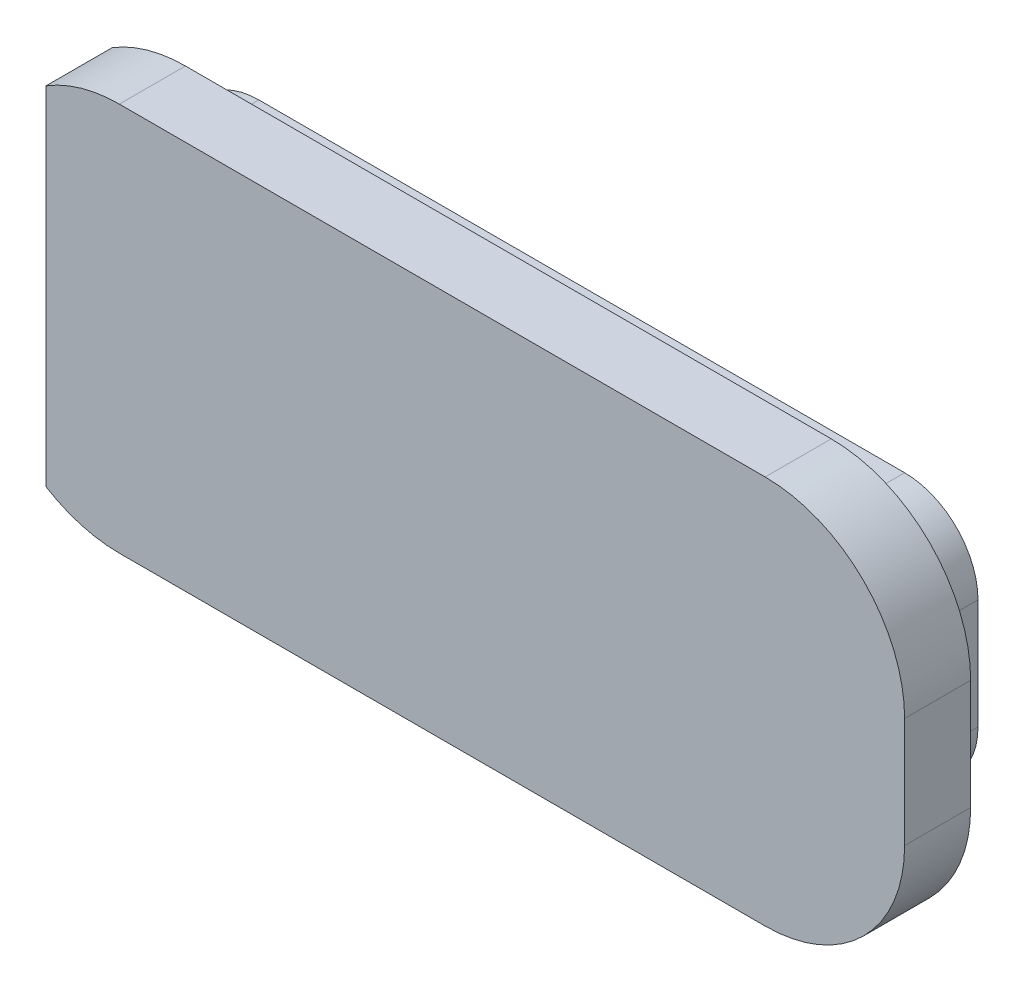
ISO-10303-21;
HEADER;
FILE_DESCRIPTION(('STEP AP214'),'2;1');
FILE_NAME('part.step','',(''),(''),'','','');
FILE_SCHEMA(('AUTOMOTIVE_DESIGN { 1 0 10303 214 1 1 1 1 }'));
ENDSEC;
DATA;
#1=APPLICATION_CONTEXT('core data for automotive mechanical design processes');
#2=APPLICATION_PROTOCOL_DEFINITION('international standard','automotive_design',2000,#1);
#3=PRODUCT_CONTEXT('',#1,'mechanical');
#4=PRODUCT('Part','Part','',(#3));
#5=PRODUCT_RELATED_PRODUCT_CATEGORY('part','',(#4));
#6=PRODUCT_DEFINITION_FORMATION('','',#4);
#7=PRODUCT_DEFINITION_CONTEXT('part definition',#1,'design');
#8=PRODUCT_DEFINITION('design','',#6,#7);
#9=PRODUCT_DEFINITION_SHAPE('','',#8);
#10=(LENGTH_UNIT() NAMED_UNIT(*) SI_UNIT(.MILLI.,.METRE.));
#11=(NAMED_UNIT(*) PLANE_ANGLE_UNIT() SI_UNIT($,.RADIAN.));
#12=(NAMED_UNIT(*) SI_UNIT($,.STERADIAN.) SOLID_ANGLE_UNIT());
#13=UNCERTAINTY_MEASURE_WITH_UNIT(LENGTH_MEASURE(1.E-05),#10,'distance_accuracy_value','');
#14=(GEOMETRIC_REPRESENTATION_CONTEXT(3) GLOBAL_UNCERTAINTY_ASSIGNED_CONTEXT((#13)) GLOBAL_UNIT_ASSIGNED_CONTEXT((#10,
#11,#12)) REPRESENTATION_CONTEXT('',''));
#15=CARTESIAN_POINT('',(0.,0.,0.));
#16=DIRECTION('',(0.,0.,1.));
#17=DIRECTION('',(1.,0.,0.));
#18=AXIS2_PLACEMENT_3D('',#15,#16,#17);
#19=CARTESIAN_POINT('',(1.,1.,-1.));
#20=DIRECTION('',(0.,0.,1.));
#21=DIRECTION('',(1.,0.,0.));
#22=AXIS2_PLACEMENT_3D('',#19,#20,#21);
#23=CYLINDRICAL_SURFACE('',#22,1.);
#24=CARTESIAN_POINT('',(1.,1.,0.));
#25=DIRECTION('',(0.,0.,1.));
#26=DIRECTION('',(1.,0.,0.));
#27=AXIS2_PLACEMENT_3D('',#24,#25,#26);
#28=CIRCLE('',#27,1.);
#29=CARTESIAN_POINT('',(0.,1.,0.));
#30=VERTEX_POINT('',#29);
#31=CARTESIAN_POINT('',(1.,0.,0.));
#32=VERTEX_POINT('',#31);
#33=EDGE_CURVE('E137',#30,#32,#28,.T.);
#34=ORIENTED_EDGE('',*,*,#33,.F.);
#35=DIRECTION('',(0.,0.,1.));
#36=VECTOR('',#35,1.);
#37=CARTESIAN_POINT('',(0.,1.,-1.));
#38=LINE('',#37,#36);
#39=CARTESIAN_POINT('',(0.,1.,-1.));
#40=VERTEX_POINT('',#39);
#41=EDGE_CURVE('E11',#40,#30,#38,.T.);
#42=ORIENTED_EDGE('',*,*,#41,.F.);
#43=CARTESIAN_POINT('',(1.,1.,-1.));
#44=DIRECTION('',(0.,0.,1.));
#45=DIRECTION('',(1.,0.,0.));
#46=AXIS2_PLACEMENT_3D('',#43,#44,#45);
#47=CIRCLE('',#46,1.);
#48=CARTESIAN_POINT('',(1.,0.,-1.));
#49=VERTEX_POINT('',#48);
#50=EDGE_CURVE('E155',#40,#49,#47,.T.);
#51=ORIENTED_EDGE('',*,*,#50,.T.);
#52=DIRECTION('',(0.,0.,1.));
#53=VECTOR('',#52,1.);
#54=CARTESIAN_POINT('',(1.,0.,-1.));
#55=LINE('',#54,#53);
#56=EDGE_CURVE('E42',#49,#32,#55,.T.);
#57=ORIENTED_EDGE('',*,*,#56,.T.);
#58=EDGE_LOOP('',(#34,#42,#51,#57));
#59=FACE_BOUND('',#58,.T.);
#60=ADVANCED_FACE('F39',(#59),#23,.T.);
#61=CARTESIAN_POINT('',(0.,2.5,-1.));
#62=DIRECTION('',(-1.,0.,0.));
#63=DIRECTION('',(0.,0.,1.));
#64=AXIS2_PLACEMENT_3D('',#61,#62,#63);
#65=PLANE('',#64);
#66=ORIENTED_EDGE('',*,*,#41,.T.);
#67=DIRECTION('',(0.,-1.,0.));
#68=VECTOR('',#67,1.);
#69=CARTESIAN_POINT('',(0.,-0.61554944214,0.));
#70=LINE('',#69,#68);
#71=CARTESIAN_POINT('',(0.,-0.61554944214,0.));
#72=VERTEX_POINT('',#71);
#73=EDGE_CURVE('E169',#30,#72,#70,.T.);
#74=ORIENTED_EDGE('',*,*,#73,.T.);
#75=DIRECTION('',(0.,0.,-1.));
#76=VECTOR('',#75,1.);
#77=CARTESIAN_POINT('',(0.,-0.61554944214,0.9));
#78=LINE('',#77,#76);
#79=CARTESIAN_POINT('',(0.,-0.61554944214,0.9));
#80=VERTEX_POINT('',#79);
#81=EDGE_CURVE('E186',#80,#72,#78,.T.);
#82=ORIENTED_EDGE('',*,*,#81,.F.);
#83=DIRECTION('',(0.,-1.,0.));
#84=VECTOR('',#83,1.);
#85=CARTESIAN_POINT('',(0.,-0.61554944214,0.9));
#86=LINE('',#85,#84);
#87=CARTESIAN_POINT('',(0.,4.11554944214,0.9));
#88=VERTEX_POINT('',#87);
#89=EDGE_CURVE('E189',#88,#80,#86,.T.);
#90=ORIENTED_EDGE('',*,*,#89,.F.);
#91=DIRECTION('',(0.,0.,-1.));
#92=VECTOR('',#91,1.);
#93=CARTESIAN_POINT('',(0.,4.11554944214,0.9));
#94=LINE('',#93,#92);
#95=CARTESIAN_POINT('',(0.,4.11554944214,0.));
#96=VERTEX_POINT('',#95);
#97=EDGE_CURVE('E188',#88,#96,#94,.T.);
#98=ORIENTED_EDGE('',*,*,#97,.T.);
#99=CARTESIAN_POINT('',(0.,2.5,0.));
#100=VERTEX_POINT('',#99);
#101=EDGE_CURVE('E176',#96,#100,#70,.T.);
#102=ORIENTED_EDGE('',*,*,#101,.T.);
#103=DIRECTION('',(0.,0.,1.));
#104=VECTOR('',#103,1.);
#105=CARTESIAN_POINT('',(0.,2.5,-1.));
#106=LINE('',#105,#104);
#107=CARTESIAN_POINT('',(0.,2.5,-1.));
#108=VERTEX_POINT('',#107);
#109=EDGE_CURVE('E48',#108,#100,#106,.T.);
#110=ORIENTED_EDGE('',*,*,#109,.F.);
#111=DIRECTION('',(0.,-1.,0.));
#112=VECTOR('',#111,1.);
#113=CARTESIAN_POINT('',(0.,2.5,-1.));
#114=LINE('',#113,#112);
#115=EDGE_CURVE('E127',#108,#40,#114,.T.);
#116=ORIENTED_EDGE('',*,*,#115,.T.);
#117=EDGE_LOOP('',(#66,#74,#82,#90,#98,#102,#110,#116));
#118=FACE_BOUND('',#117,.T.);
#119=ADVANCED_FACE('F234',(#118),#65,.T.);
#120=CARTESIAN_POINT('',(1.,2.5,-1.));
#121=DIRECTION('',(0.,0.,1.));
#122=DIRECTION('',(1.,0.,0.));
#123=AXIS2_PLACEMENT_3D('',#120,#121,#122);
#124=CYLINDRICAL_SURFACE('',#123,1.);
#125=CARTESIAN_POINT('',(1.,2.5,0.));
#126=DIRECTION('',(0.,0.,1.));
#127=DIRECTION('',(1.,0.,0.));
#128=AXIS2_PLACEMENT_3D('',#125,#126,#127);
#129=CIRCLE('',#128,1.);
#130=CARTESIAN_POINT('',(1.,3.5,0.));
#131=VERTEX_POINT('',#130);
#132=EDGE_CURVE('E117',#131,#100,#129,.T.);
#133=ORIENTED_EDGE('',*,*,#132,.F.);
#134=DIRECTION('',(0.,0.,1.));
#135=VECTOR('',#134,1.);
#136=CARTESIAN_POINT('',(1.,3.5,-1.));
#137=LINE('',#136,#135);
#138=CARTESIAN_POINT('',(1.,3.5,-1.));
#139=VERTEX_POINT('',#138);
#140=EDGE_CURVE('E83',#139,#131,#137,.T.);
#141=ORIENTED_EDGE('',*,*,#140,.F.);
#142=CARTESIAN_POINT('',(1.,2.5,-1.));
#143=DIRECTION('',(0.,0.,1.));
#144=DIRECTION('',(1.,0.,0.));
#145=AXIS2_PLACEMENT_3D('',#142,#143,#144);
#146=CIRCLE('',#145,1.);
#147=EDGE_CURVE('E114',#139,#108,#146,.T.);
#148=ORIENTED_EDGE('',*,*,#147,.T.);
#149=ORIENTED_EDGE('',*,*,#109,.T.);
#150=EDGE_LOOP('',(#133,#141,#148,#149));
#151=FACE_BOUND('',#150,.T.);
#152=ADVANCED_FACE('F112',(#151),#124,.T.);
#153=CARTESIAN_POINT('',(9.8,3.5,-1.));
#154=DIRECTION('',(0.,1.,0.));
#155=DIRECTION('',(0.,0.,1.));
#156=AXIS2_PLACEMENT_3D('',#153,#154,#155);
#157=PLANE('',#156);
#158=DIRECTION('',(-1.,0.,0.));
#159=VECTOR('',#158,1.);
#160=CARTESIAN_POINT('',(9.8,3.5,0.));
#161=LINE('',#160,#159);
#162=CARTESIAN_POINT('',(9.8,3.5,0.));
#163=VERTEX_POINT('',#162);
#164=EDGE_CURVE('E153',#163,#131,#161,.T.);
#165=ORIENTED_EDGE('',*,*,#164,.F.);
#166=DIRECTION('',(0.,0.,1.));
#167=VECTOR('',#166,1.);
#168=CARTESIAN_POINT('',(9.8,3.5,-1.));
#169=LINE('',#168,#167);
#170=CARTESIAN_POINT('',(9.8,3.5,-1.));
#171=VERTEX_POINT('',#170);
#172=EDGE_CURVE('E119',#171,#163,#169,.T.);
#173=ORIENTED_EDGE('',*,*,#172,.F.);
#174=DIRECTION('',(-1.,0.,0.));
#175=VECTOR('',#174,1.);
#176=CARTESIAN_POINT('',(9.8,3.5,-1.));
#177=LINE('',#176,#175);
#178=EDGE_CURVE('E125',#171,#139,#177,.T.);
#179=ORIENTED_EDGE('',*,*,#178,.T.);
#180=ORIENTED_EDGE('',*,*,#140,.T.);
#181=EDGE_LOOP('',(#165,#173,#179,#180));
#182=FACE_BOUND('',#181,.T.);
#183=ADVANCED_FACE('F129',(#182),#157,.T.);
#184=CARTESIAN_POINT('',(9.8,2.5,-1.));
#185=DIRECTION('',(0.,0.,1.));
#186=DIRECTION('',(1.,0.,0.));
#187=AXIS2_PLACEMENT_3D('',#184,#185,#186);
#188=CYLINDRICAL_SURFACE('',#187,1.);
#189=CARTESIAN_POINT('',(9.8,2.5,0.));
#190=DIRECTION('',(0.,0.,1.));
#191=DIRECTION('',(1.,0.,0.));
#192=AXIS2_PLACEMENT_3D('',#189,#190,#191);
#193=CIRCLE('',#192,1.);
#194=CARTESIAN_POINT('',(10.8,2.5,0.));
#195=VERTEX_POINT('',#194);
#196=EDGE_CURVE('E150',#195,#163,#193,.T.);
#197=ORIENTED_EDGE('',*,*,#196,.F.);
#198=DIRECTION('',(0.,0.,1.));
#199=VECTOR('',#198,1.);
#200=CARTESIAN_POINT('',(10.8,2.5,-1.));
#201=LINE('',#200,#199);
#202=CARTESIAN_POINT('',(10.8,2.5,-1.));
#203=VERTEX_POINT('',#202);
#204=EDGE_CURVE('E159',#203,#195,#201,.T.);
#205=ORIENTED_EDGE('',*,*,#204,.F.);
#206=CARTESIAN_POINT('',(9.8,2.5,-1.));
#207=DIRECTION('',(0.,0.,1.));
#208=DIRECTION('',(1.,0.,0.));
#209=AXIS2_PLACEMENT_3D('',#206,#207,#208);
#210=CIRCLE('',#209,1.);
#211=EDGE_CURVE('E130',#203,#171,#210,.T.);
#212=ORIENTED_EDGE('',*,*,#211,.T.);
#213=ORIENTED_EDGE('',*,*,#172,.T.);
#214=EDGE_LOOP('',(#197,#205,#212,#213));
#215=FACE_BOUND('',#214,.T.);
#216=ADVANCED_FACE('F224',(#215),#188,.T.);
#217=CARTESIAN_POINT('',(10.8,1.,-1.));
#218=DIRECTION('',(1.,0.,0.));
#219=DIRECTION('',(0.,0.,-1.));
#220=AXIS2_PLACEMENT_3D('',#217,#218,#219);
#221=PLANE('',#220);
#222=DIRECTION('',(0.,1.,0.));
#223=VECTOR('',#222,1.);
#224=CARTESIAN_POINT('',(10.8,1.,0.));
#225=LINE('',#224,#223);
#226=CARTESIAN_POINT('',(10.8,1.,0.));
#227=VERTEX_POINT('',#226);
#228=EDGE_CURVE('E147',#227,#195,#225,.T.);
#229=ORIENTED_EDGE('',*,*,#228,.F.);
#230=DIRECTION('',(0.,0.,1.));
#231=VECTOR('',#230,1.);
#232=CARTESIAN_POINT('',(10.8,1.,-1.));
#233=LINE('',#232,#231);
#234=CARTESIAN_POINT('',(10.8,1.,-1.));
#235=VERTEX_POINT('',#234);
#236=EDGE_CURVE('E161',#235,#227,#233,.T.);
#237=ORIENTED_EDGE('',*,*,#236,.F.);
#238=DIRECTION('',(0.,1.,0.));
#239=VECTOR('',#238,1.);
#240=CARTESIAN_POINT('',(10.8,1.,-1.));
#241=LINE('',#240,#239);
#242=EDGE_CURVE('E132',#235,#203,#241,.T.);
#243=ORIENTED_EDGE('',*,*,#242,.T.);
#244=ORIENTED_EDGE('',*,*,#204,.T.);
#245=EDGE_LOOP('',(#229,#237,#243,#244));
#246=FACE_BOUND('',#245,.T.);
#247=ADVANCED_FACE('F218',(#246),#221,.T.);
#248=CARTESIAN_POINT('',(9.8,1.,-1.));
#249=DIRECTION('',(0.,0.,1.));
#250=DIRECTION('',(1.,0.,0.));
#251=AXIS2_PLACEMENT_3D('',#248,#249,#250);
#252=CYLINDRICAL_SURFACE('',#251,1.);
#253=CARTESIAN_POINT('',(9.8,1.,0.));
#254=DIRECTION('',(0.,0.,1.));
#255=DIRECTION('',(1.,0.,0.));
#256=AXIS2_PLACEMENT_3D('',#253,#254,#255);
#257=CIRCLE('',#256,1.);
#258=CARTESIAN_POINT('',(9.8,0.,0.));
#259=VERTEX_POINT('',#258);
#260=EDGE_CURVE('E144',#259,#227,#257,.T.);
#261=ORIENTED_EDGE('',*,*,#260,.F.);
#262=DIRECTION('',(0.,0.,1.));
#263=VECTOR('',#262,1.);
#264=CARTESIAN_POINT('',(9.8,0.,-1.));
#265=LINE('',#264,#263);
#266=CARTESIAN_POINT('',(9.8,0.,-1.));
#267=VERTEX_POINT('',#266);
#268=EDGE_CURVE('E162',#267,#259,#265,.T.);
#269=ORIENTED_EDGE('',*,*,#268,.F.);
#270=CARTESIAN_POINT('',(9.8,1.,-1.));
#271=DIRECTION('',(0.,0.,1.));
#272=DIRECTION('',(1.,0.,0.));
#273=AXIS2_PLACEMENT_3D('',#270,#271,#272);
#274=CIRCLE('',#273,1.);
#275=EDGE_CURVE('E212',#267,#235,#274,.T.);
#276=ORIENTED_EDGE('',*,*,#275,.T.);
#277=ORIENTED_EDGE('',*,*,#236,.T.);
#278=EDGE_LOOP('',(#261,#269,#276,#277));
#279=FACE_BOUND('',#278,.T.);
#280=ADVANCED_FACE('F222',(#279),#252,.T.);
#281=CARTESIAN_POINT('',(1.,0.,-1.));
#282=DIRECTION('',(0.,-1.,0.));
#283=DIRECTION('',(0.,0.,-1.));
#284=AXIS2_PLACEMENT_3D('',#281,#282,#283);
#285=PLANE('',#284);
#286=DIRECTION('',(1.,0.,0.));
#287=VECTOR('',#286,1.);
#288=CARTESIAN_POINT('',(1.,0.,0.));
#289=LINE('',#288,#287);
#290=EDGE_CURVE('E140',#32,#259,#289,.T.);
#291=ORIENTED_EDGE('',*,*,#290,.F.);
#292=ORIENTED_EDGE('',*,*,#56,.F.);
#293=DIRECTION('',(1.,0.,0.));
#294=VECTOR('',#293,1.);
#295=CARTESIAN_POINT('',(1.,0.,-1.));
#296=LINE('',#295,#294);
#297=EDGE_CURVE('E210',#49,#267,#296,.T.);
#298=ORIENTED_EDGE('',*,*,#297,.T.);
#299=ORIENTED_EDGE('',*,*,#268,.T.);
#300=EDGE_LOOP('',(#291,#292,#298,#299));
#301=FACE_BOUND('',#300,.T.);
#302=ADVANCED_FACE('F165',(#301),#285,.T.);
#303=CARTESIAN_POINT('',(1.,1.,-1.));
#304=DIRECTION('',(0.,0.,1.));
#305=DIRECTION('',(1.,0.,0.));
#306=AXIS2_PLACEMENT_3D('',#303,#304,#305);
#307=PLANE('',#306);
#308=ORIENTED_EDGE('',*,*,#50,.F.);
#309=ORIENTED_EDGE('',*,*,#115,.F.);
#310=ORIENTED_EDGE('',*,*,#147,.F.);
#311=ORIENTED_EDGE('',*,*,#178,.F.);
#312=ORIENTED_EDGE('',*,*,#211,.F.);
#313=ORIENTED_EDGE('',*,*,#242,.F.);
#314=ORIENTED_EDGE('',*,*,#275,.F.);
#315=ORIENTED_EDGE('',*,*,#297,.F.);
#316=EDGE_LOOP('',(#308,#309,#310,#311,#312,#313,#314,#315));
#317=FACE_BOUND('',#316,.T.);
#318=ADVANCED_FACE('F123',(#317),#307,.F.);
#319=CARTESIAN_POINT('',(1.00000000000008,1.00000000000013,0.9));
#320=DIRECTION('',(0.,0.,-1.));
#321=DIRECTION('',(-1.,0.,0.));
#322=AXIS2_PLACEMENT_3D('',#319,#320,#321);
#323=CYLINDRICAL_SURFACE('',#322,1.89999999999985);
#324=CARTESIAN_POINT('',(1.00000000000008,1.00000000000013,0.));
#325=DIRECTION('',(0.,0.,1.));
#326=DIRECTION('',(1.,0.,0.));
#327=AXIS2_PLACEMENT_3D('',#324,#325,#326);
#328=CIRCLE('',#327,1.89999999999985);
#329=CARTESIAN_POINT('',(1.00000000000008,-0.899999999999723,0.));
#330=VERTEX_POINT('',#329);
#331=EDGE_CURVE('E173',#72,#330,#328,.T.);
#332=ORIENTED_EDGE('',*,*,#331,.T.);
#333=DIRECTION('',(0.,0.,-1.));
#334=VECTOR('',#333,1.);
#335=CARTESIAN_POINT('',(1.00000000000008,-0.899999999999723,0.9));
#336=LINE('',#335,#334);
#337=CARTESIAN_POINT('',(1.00000000000008,-0.899999999999723,0.9));
#338=VERTEX_POINT('',#337);
#339=EDGE_CURVE('E141',#338,#330,#336,.T.);
#340=ORIENTED_EDGE('',*,*,#339,.F.);
#341=CARTESIAN_POINT('',(1.00000000000008,1.00000000000013,0.9));
#342=DIRECTION('',(0.,0.,1.));
#343=DIRECTION('',(1.,0.,0.));
#344=AXIS2_PLACEMENT_3D('',#341,#342,#343);
#345=CIRCLE('',#344,1.89999999999985);
#346=EDGE_CURVE('E180',#80,#338,#345,.T.);
#347=ORIENTED_EDGE('',*,*,#346,.F.);
#348=ORIENTED_EDGE('',*,*,#81,.T.);
#349=EDGE_LOOP('',(#332,#340,#347,#348));
#350=FACE_BOUND('',#349,.T.);
#351=ADVANCED_FACE('F246',(#350),#323,.T.);
#352=CARTESIAN_POINT('',(9.80000000000008,-0.899999999999723,0.9));
#353=DIRECTION('',(0.,1.,0.));
#354=DIRECTION('',(0.,0.,1.));
#355=AXIS2_PLACEMENT_3D('',#352,#353,#354);
#356=PLANE('',#355);
#357=DIRECTION('',(1.,0.,0.));
#358=VECTOR('',#357,1.);
#359=CARTESIAN_POINT('',(9.80000000000008,-0.899999999999723,0.));
#360=LINE('',#359,#358);
#361=CARTESIAN_POINT('',(9.80000000000008,-0.899999999999724,0.));
#362=VERTEX_POINT('',#361);
#363=EDGE_CURVE('E300',#330,#362,#360,.T.);
#364=ORIENTED_EDGE('',*,*,#363,.T.);
#365=DIRECTION('',(0.,0.,-1.));
#366=VECTOR('',#365,1.);
#367=CARTESIAN_POINT('',(9.80000000000008,-0.899999999999724,0.9));
#368=LINE('',#367,#366);
#369=CARTESIAN_POINT('',(9.80000000000008,-0.899999999999724,0.9));
#370=VERTEX_POINT('',#369);
#371=EDGE_CURVE('E204',#370,#362,#368,.T.);
#372=ORIENTED_EDGE('',*,*,#371,.F.);
#373=DIRECTION('',(1.,0.,0.));
#374=VECTOR('',#373,1.);
#375=CARTESIAN_POINT('',(9.80000000000008,-0.899999999999723,0.9));
#376=LINE('',#375,#374);
#377=EDGE_CURVE('E290',#338,#370,#376,.T.);
#378=ORIENTED_EDGE('',*,*,#377,.F.);
#379=ORIENTED_EDGE('',*,*,#339,.T.);
#380=EDGE_LOOP('',(#364,#372,#378,#379));
#381=FACE_BOUND('',#380,.T.);
#382=ADVANCED_FACE('F249',(#381),#356,.F.);
#383=CARTESIAN_POINT('',(9.80000000000008,1.00000000000028,0.9));
#384=DIRECTION('',(0.,0.,-1.));
#385=DIRECTION('',(-1.,0.,0.));
#386=AXIS2_PLACEMENT_3D('',#383,#384,#385);
#387=CYLINDRICAL_SURFACE('',#386,1.9);
#388=CARTESIAN_POINT('',(9.80000000000008,1.00000000000028,0.));
#389=DIRECTION('',(0.,0.,1.));
#390=DIRECTION('',(1.,0.,0.));
#391=AXIS2_PLACEMENT_3D('',#388,#389,#390);
#392=CIRCLE('',#391,1.9);
#393=CARTESIAN_POINT('',(11.7000000000001,1.00000000000028,0.));
#394=VERTEX_POINT('',#393);
#395=EDGE_CURVE('E347',#362,#394,#392,.T.);
#396=ORIENTED_EDGE('',*,*,#395,.T.);
#397=DIRECTION('',(0.,0.,-1.));
#398=VECTOR('',#397,1.);
#399=CARTESIAN_POINT('',(11.7000000000001,1.00000000000028,0.9));
#400=LINE('',#399,#398);
#401=CARTESIAN_POINT('',(11.7000000000001,1.00000000000028,0.9));
#402=VERTEX_POINT('',#401);
#403=EDGE_CURVE('E201',#402,#394,#400,.T.);
#404=ORIENTED_EDGE('',*,*,#403,.F.);
#405=CARTESIAN_POINT('',(9.80000000000008,1.00000000000028,0.9));
#406=DIRECTION('',(0.,0.,1.));
#407=DIRECTION('',(1.,0.,0.));
#408=AXIS2_PLACEMENT_3D('',#405,#406,#407);
#409=CIRCLE('',#408,1.9);
#410=EDGE_CURVE('E341',#370,#402,#409,.T.);
#411=ORIENTED_EDGE('',*,*,#410,.F.);
#412=ORIENTED_EDGE('',*,*,#371,.T.);
#413=EDGE_LOOP('',(#396,#404,#411,#412));
#414=FACE_BOUND('',#413,.T.);
#415=ADVANCED_FACE('F253',(#414),#387,.T.);
#416=CARTESIAN_POINT('',(11.7000000000001,2.50000000000028,0.9));
#417=DIRECTION('',(-1.,0.,0.));
#418=DIRECTION('',(0.,0.,1.));
#419=AXIS2_PLACEMENT_3D('',#416,#417,#418);
#420=PLANE('',#419);
#421=DIRECTION('',(0.,1.,0.));
#422=VECTOR('',#421,1.);
#423=CARTESIAN_POINT('',(11.7000000000001,2.50000000000028,0.));
#424=LINE('',#423,#422);
#425=CARTESIAN_POINT('',(11.7000000000001,2.50000000000028,0.));
#426=VERTEX_POINT('',#425);
#427=EDGE_CURVE('E362',#394,#426,#424,.T.);
#428=ORIENTED_EDGE('',*,*,#427,.T.);
#429=DIRECTION('',(0.,0.,-1.));
#430=VECTOR('',#429,1.);
#431=CARTESIAN_POINT('',(11.7000000000001,2.50000000000028,0.9));
#432=LINE('',#431,#430);
#433=CARTESIAN_POINT('',(11.7000000000001,2.50000000000028,0.9));
#434=VERTEX_POINT('',#433);
#435=EDGE_CURVE('E198',#434,#426,#432,.T.);
#436=ORIENTED_EDGE('',*,*,#435,.F.);
#437=DIRECTION('',(0.,1.,0.));
#438=VECTOR('',#437,1.);
#439=CARTESIAN_POINT('',(11.7000000000001,2.50000000000028,0.9));
#440=LINE('',#439,#438);
#441=EDGE_CURVE('E344',#402,#434,#440,.T.);
#442=ORIENTED_EDGE('',*,*,#441,.F.);
#443=ORIENTED_EDGE('',*,*,#403,.T.);
#444=EDGE_LOOP('',(#428,#436,#442,#443));
#445=FACE_BOUND('',#444,.T.);
#446=ADVANCED_FACE('F257',(#445),#420,.F.);
#447=CARTESIAN_POINT('',(9.80000000000008,2.49999999999972,0.9));
#448=DIRECTION('',(0.,0.,-1.));
#449=DIRECTION('',(-1.,0.,0.));
#450=AXIS2_PLACEMENT_3D('',#447,#448,#449);
#451=CYLINDRICAL_SURFACE('',#450,1.9);
#452=CARTESIAN_POINT('',(9.80000000000008,2.49999999999972,0.));
#453=DIRECTION('',(0.,0.,1.));
#454=DIRECTION('',(1.,0.,0.));
#455=AXIS2_PLACEMENT_3D('',#452,#453,#454);
#456=CIRCLE('',#455,1.9);
#457=CARTESIAN_POINT('',(9.80000000000008,4.39999999999972,0.));
#458=VERTEX_POINT('',#457);
#459=EDGE_CURVE('E364',#426,#458,#456,.T.);
#460=ORIENTED_EDGE('',*,*,#459,.T.);
#461=DIRECTION('',(0.,0.,-1.));
#462=VECTOR('',#461,1.);
#463=CARTESIAN_POINT('',(9.80000000000008,4.39999999999972,0.9));
#464=LINE('',#463,#462);
#465=CARTESIAN_POINT('',(9.80000000000008,4.39999999999972,0.9));
#466=VERTEX_POINT('',#465);
#467=EDGE_CURVE('E195',#466,#458,#464,.T.);
#468=ORIENTED_EDGE('',*,*,#467,.F.);
#469=CARTESIAN_POINT('',(9.80000000000008,2.49999999999972,0.9));
#470=DIRECTION('',(0.,0.,1.));
#471=DIRECTION('',(1.,0.,0.));
#472=AXIS2_PLACEMENT_3D('',#469,#470,#471);
#473=CIRCLE('',#472,1.9);
#474=EDGE_CURVE('E350',#434,#466,#473,.T.);
#475=ORIENTED_EDGE('',*,*,#474,.F.);
#476=ORIENTED_EDGE('',*,*,#435,.T.);
#477=EDGE_LOOP('',(#460,#468,#475,#476));
#478=FACE_BOUND('',#477,.T.);
#479=ADVANCED_FACE('F261',(#478),#451,.T.);
#480=CARTESIAN_POINT('',(1.00000000000008,4.39999999999972,0.9));
#481=DIRECTION('',(0.,-1.,0.));
#482=DIRECTION('',(0.,0.,-1.));
#483=AXIS2_PLACEMENT_3D('',#480,#481,#482);
#484=PLANE('',#483);
#485=DIRECTION('',(-1.,0.,0.));
#486=VECTOR('',#485,1.);
#487=CARTESIAN_POINT('',(1.00000000000008,4.39999999999972,0.));
#488=LINE('',#487,#486);
#489=CARTESIAN_POINT('',(1.00000000000008,4.39999999999972,0.));
#490=VERTEX_POINT('',#489);
#491=EDGE_CURVE('E182',#458,#490,#488,.T.);
#492=ORIENTED_EDGE('',*,*,#491,.T.);
#493=DIRECTION('',(0.,0.,-1.));
#494=VECTOR('',#493,1.);
#495=CARTESIAN_POINT('',(1.00000000000008,4.39999999999972,0.9));
#496=LINE('',#495,#494);
#497=CARTESIAN_POINT('',(1.00000000000008,4.39999999999972,0.9));
#498=VERTEX_POINT('',#497);
#499=EDGE_CURVE('E192',#498,#490,#496,.T.);
#500=ORIENTED_EDGE('',*,*,#499,.F.);
#501=DIRECTION('',(-1.,0.,0.));
#502=VECTOR('',#501,1.);
#503=CARTESIAN_POINT('',(1.00000000000008,4.39999999999972,0.9));
#504=LINE('',#503,#502);
#505=EDGE_CURVE('E352',#466,#498,#504,.T.);
#506=ORIENTED_EDGE('',*,*,#505,.F.);
#507=ORIENTED_EDGE('',*,*,#467,.T.);
#508=EDGE_LOOP('',(#492,#500,#506,#507));
#509=FACE_BOUND('',#508,.T.);
#510=ADVANCED_FACE('F265',(#509),#484,.F.);
#511=CARTESIAN_POINT('',(1.00000000000008,2.49999999999987,0.9));
#512=DIRECTION('',(0.,0.,-1.));
#513=DIRECTION('',(-1.,0.,0.));
#514=AXIS2_PLACEMENT_3D('',#511,#512,#513);
#515=CYLINDRICAL_SURFACE('',#514,1.89999999999985);
#516=CARTESIAN_POINT('',(1.00000000000008,2.49999999999987,0.));
#517=DIRECTION('',(0.,0.,1.));
#518=DIRECTION('',(1.,0.,0.));
#519=AXIS2_PLACEMENT_3D('',#516,#517,#518);
#520=CIRCLE('',#519,1.89999999999985);
#521=EDGE_CURVE('E177',#490,#96,#520,.T.);
#522=ORIENTED_EDGE('',*,*,#521,.T.);
#523=ORIENTED_EDGE('',*,*,#97,.F.);
#524=CARTESIAN_POINT('',(1.00000000000008,2.49999999999987,0.9));
#525=DIRECTION('',(0.,0.,1.));
#526=DIRECTION('',(1.,0.,0.));
#527=AXIS2_PLACEMENT_3D('',#524,#525,#526);
#528=CIRCLE('',#527,1.89999999999985);
#529=EDGE_CURVE('E329',#498,#88,#528,.T.);
#530=ORIENTED_EDGE('',*,*,#529,.F.);
#531=ORIENTED_EDGE('',*,*,#499,.T.);
#532=EDGE_LOOP('',(#522,#523,#530,#531));
#533=FACE_BOUND('',#532,.T.);
#534=ADVANCED_FACE('F269',(#533),#515,.T.);
#535=CARTESIAN_POINT('',(1.00000000000008,1.00000000000013,0.9));
#536=DIRECTION('',(0.,0.,1.));
#537=DIRECTION('',(1.,0.,0.));
#538=AXIS2_PLACEMENT_3D('',#535,#536,#537);
#539=PLANE('',#538);
#540=ORIENTED_EDGE('',*,*,#346,.T.);
#541=ORIENTED_EDGE('',*,*,#377,.T.);
#542=ORIENTED_EDGE('',*,*,#410,.T.);
#543=ORIENTED_EDGE('',*,*,#441,.T.);
#544=ORIENTED_EDGE('',*,*,#474,.T.);
#545=ORIENTED_EDGE('',*,*,#505,.T.);
#546=ORIENTED_EDGE('',*,*,#529,.T.);
#547=ORIENTED_EDGE('',*,*,#89,.T.);
#548=EDGE_LOOP('',(#540,#541,#542,#543,#544,#545,#546,#547));
#549=FACE_BOUND('',#548,.T.);
#550=ADVANCED_FACE('F273',(#549),#539,.T.);
#551=CARTESIAN_POINT('',(1.00000000000008,1.00000000000013,0.));
#552=DIRECTION('',(0.,0.,1.));
#553=DIRECTION('',(1.,0.,0.));
#554=AXIS2_PLACEMENT_3D('',#551,#552,#553);
#555=PLANE('',#554);
#556=ORIENTED_EDGE('',*,*,#73,.F.);
#557=ORIENTED_EDGE('',*,*,#33,.T.);
#558=ORIENTED_EDGE('',*,*,#290,.T.);
#559=ORIENTED_EDGE('',*,*,#260,.T.);
#560=ORIENTED_EDGE('',*,*,#228,.T.);
#561=ORIENTED_EDGE('',*,*,#196,.T.);
#562=ORIENTED_EDGE('',*,*,#164,.T.);
#563=ORIENTED_EDGE('',*,*,#132,.T.);
#564=ORIENTED_EDGE('',*,*,#101,.F.);
#565=ORIENTED_EDGE('',*,*,#521,.F.);
#566=ORIENTED_EDGE('',*,*,#491,.F.);
#567=ORIENTED_EDGE('',*,*,#459,.F.);
#568=ORIENTED_EDGE('',*,*,#427,.F.);
#569=ORIENTED_EDGE('',*,*,#395,.F.);
#570=ORIENTED_EDGE('',*,*,#363,.F.);
#571=ORIENTED_EDGE('',*,*,#331,.F.);
#572=EDGE_LOOP('',(#556,#557,#558,#559,#560,#561,#562,#563,#564,#565,#566,#567,#568,#569,#570,#571));
#573=FACE_BOUND('',#572,.T.);
#574=ADVANCED_FACE('F167',(#573),#555,.F.);
#575=CLOSED_SHELL('',(#60,#119,#152,#183,#216,#247,#280,#302,#318,#351,#382,#415,#446,#479,#510,
#534,#550,#574));
#576=MANIFOLD_SOLID_BREP('B2',#575);
#577=ADVANCED_BREP_SHAPE_REPRESENTATION('',(#18,#576),#14);
#578=SHAPE_DEFINITION_REPRESENTATION(#9,#577);
ENDSEC;
END-ISO-10303-21;
